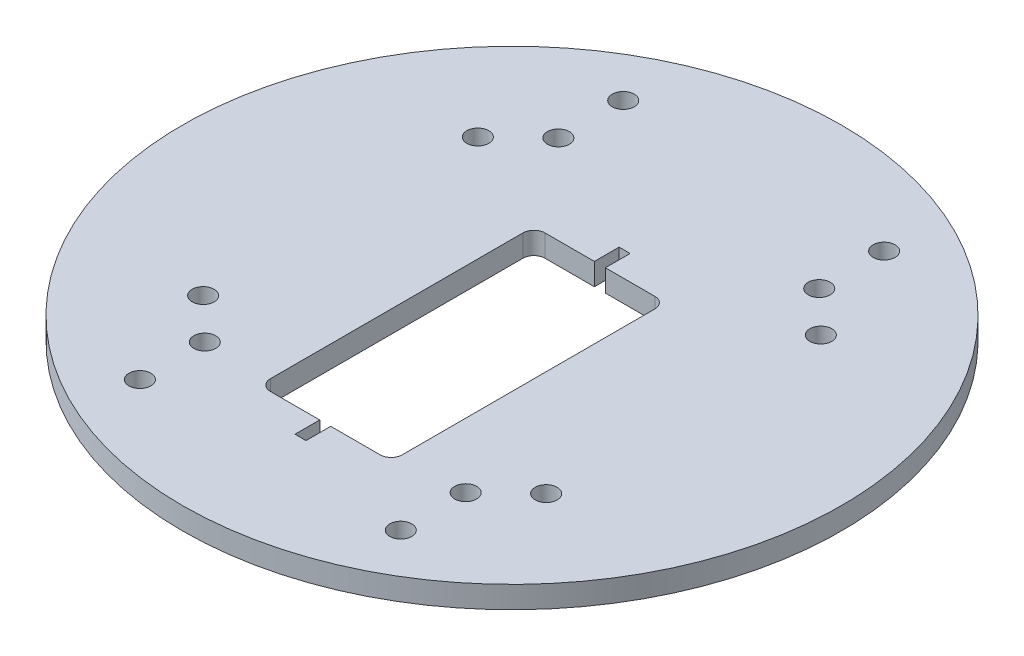
ISO-10303-21;
HEADER;
FILE_DESCRIPTION(('STEP AP214'),'2;1');
FILE_NAME('part.step','',(''),(''),'','','');
FILE_SCHEMA(('AUTOMOTIVE_DESIGN { 1 0 10303 214 1 1 1 1 }'));
ENDSEC;
DATA;
#1=APPLICATION_CONTEXT('core data for automotive mechanical design processes');
#2=APPLICATION_PROTOCOL_DEFINITION('international standard','automotive_design',2000,#1);
#3=PRODUCT_CONTEXT('',#1,'mechanical');
#4=PRODUCT('Part','Part','',(#3));
#5=PRODUCT_RELATED_PRODUCT_CATEGORY('part','',(#4));
#6=PRODUCT_DEFINITION_FORMATION('','',#4);
#7=PRODUCT_DEFINITION_CONTEXT('part definition',#1,'design');
#8=PRODUCT_DEFINITION('design','',#6,#7);
#9=PRODUCT_DEFINITION_SHAPE('','',#8);
#10=(LENGTH_UNIT() NAMED_UNIT(*) SI_UNIT(.MILLI.,.METRE.));
#11=(NAMED_UNIT(*) PLANE_ANGLE_UNIT() SI_UNIT($,.RADIAN.));
#12=(NAMED_UNIT(*) SI_UNIT($,.STERADIAN.) SOLID_ANGLE_UNIT());
#13=UNCERTAINTY_MEASURE_WITH_UNIT(LENGTH_MEASURE(1.E-05),#10,'distance_accuracy_value','');
#14=(GEOMETRIC_REPRESENTATION_CONTEXT(3) GLOBAL_UNCERTAINTY_ASSIGNED_CONTEXT((#13)) GLOBAL_UNIT_ASSIGNED_CONTEXT((#10,
#11,#12)) REPRESENTATION_CONTEXT('',''));
#15=CARTESIAN_POINT('',(0.,0.,0.));
#16=DIRECTION('',(0.,0.,1.));
#17=DIRECTION('',(1.,0.,0.));
#18=AXIS2_PLACEMENT_3D('',#15,#16,#17);
#19=CARTESIAN_POINT('',(0.,2.,0.));
#20=DIRECTION('',(0.,1.,0.));
#21=DIRECTION('',(0.,0.,1.));
#22=AXIS2_PLACEMENT_3D('',#19,#20,#21);
#23=PLANE('',#22);
#24=DIRECTION('',(0.,0.,1.));
#25=VECTOR('',#24,1.);
#26=CARTESIAN_POINT('',(-0.5,2.,0.));
#27=LINE('',#26,#25);
#28=CARTESIAN_POINT('',(-0.499999999999992,2.,17.));
#29=VERTEX_POINT('',#28);
#30=CARTESIAN_POINT('',(-0.499999999999991,2.,19.25));
#31=VERTEX_POINT('',#30);
#32=EDGE_CURVE('E173',#29,#31,#27,.T.);
#33=ORIENTED_EDGE('',*,*,#32,.F.);
#34=DIRECTION('',(1.,0.,0.));
#35=VECTOR('',#34,1.);
#36=CARTESIAN_POINT('',(0.,2.,17.));
#37=LINE('',#36,#35);
#38=CARTESIAN_POINT('',(-4.99999999999999,2.,17.));
#39=VERTEX_POINT('',#38);
#40=EDGE_CURVE('E95',#39,#29,#37,.T.);
#41=ORIENTED_EDGE('',*,*,#40,.F.);
#42=CARTESIAN_POINT('',(-5.,2.,16.));
#43=DIRECTION('',(0.,1.,0.));
#44=DIRECTION('',(0.,0.,1.));
#45=AXIS2_PLACEMENT_3D('',#42,#43,#44);
#46=CIRCLE('',#45,1.);
#47=CARTESIAN_POINT('',(-6.,2.,16.));
#48=VERTEX_POINT('',#47);
#49=EDGE_CURVE('E40',#48,#39,#46,.T.);
#50=ORIENTED_EDGE('',*,*,#49,.F.);
#51=DIRECTION('',(0.,0.,1.));
#52=VECTOR('',#51,1.);
#53=CARTESIAN_POINT('',(-6.,2.,-6.99999999999999));
#54=LINE('',#53,#52);
#55=CARTESIAN_POINT('',(-6.,2.,-6.99999999999999));
#56=VERTEX_POINT('',#55);
#57=EDGE_CURVE('E88',#56,#48,#54,.T.);
#58=ORIENTED_EDGE('',*,*,#57,.F.);
#59=CARTESIAN_POINT('',(-5.,2.,-7.));
#60=DIRECTION('',(0.,1.,0.));
#61=DIRECTION('',(0.,0.,1.));
#62=AXIS2_PLACEMENT_3D('',#59,#60,#61);
#63=CIRCLE('',#62,1.);
#64=CARTESIAN_POINT('',(-5.,2.,-8.));
#65=VERTEX_POINT('',#64);
#66=EDGE_CURVE('E263',#65,#56,#63,.T.);
#67=ORIENTED_EDGE('',*,*,#66,.F.);
#68=DIRECTION('',(-1.,0.,0.));
#69=VECTOR('',#68,1.);
#70=CARTESIAN_POINT('',(0.,2.,-8.));
#71=LINE('',#70,#69);
#72=CARTESIAN_POINT('',(-0.500000000000012,2.,-8.));
#73=VERTEX_POINT('',#72);
#74=EDGE_CURVE('E178',#73,#65,#71,.T.);
#75=ORIENTED_EDGE('',*,*,#74,.F.);
#76=DIRECTION('',(0.,0.,1.));
#77=VECTOR('',#76,1.);
#78=CARTESIAN_POINT('',(-0.500000000000009,2.,0.));
#79=LINE('',#78,#77);
#80=CARTESIAN_POINT('',(-0.500000000000012,2.,-10.25));
#81=VERTEX_POINT('',#80);
#82=EDGE_CURVE('E267',#81,#73,#79,.T.);
#83=ORIENTED_EDGE('',*,*,#82,.F.);
#84=DIRECTION('',(-1.,0.,0.));
#85=VECTOR('',#84,1.);
#86=CARTESIAN_POINT('',(0.,2.,-10.25));
#87=LINE('',#86,#85);
#88=CARTESIAN_POINT('',(0.499999999999988,2.,-10.25));
#89=VERTEX_POINT('',#88);
#90=EDGE_CURVE('E271',#89,#81,#87,.T.);
#91=ORIENTED_EDGE('',*,*,#90,.F.);
#92=DIRECTION('',(0.,0.,-1.));
#93=VECTOR('',#92,1.);
#94=CARTESIAN_POINT('',(0.499999999999991,2.,0.));
#95=LINE('',#94,#93);
#96=CARTESIAN_POINT('',(0.499999999999988,2.,-8.));
#97=VERTEX_POINT('',#96);
#98=EDGE_CURVE('E275',#97,#89,#95,.T.);
#99=ORIENTED_EDGE('',*,*,#98,.F.);
#100=DIRECTION('',(-1.,0.,0.));
#101=VECTOR('',#100,1.);
#102=CARTESIAN_POINT('',(0.,2.,-8.));
#103=LINE('',#102,#101);
#104=CARTESIAN_POINT('',(4.99999999999999,2.,-8.));
#105=VERTEX_POINT('',#104);
#106=EDGE_CURVE('E262',#105,#97,#103,.T.);
#107=ORIENTED_EDGE('',*,*,#106,.F.);
#108=CARTESIAN_POINT('',(5.,2.,-7.));
#109=DIRECTION('',(0.,1.,0.));
#110=DIRECTION('',(0.,0.,1.));
#111=AXIS2_PLACEMENT_3D('',#108,#109,#110);
#112=CIRCLE('',#111,1.);
#113=CARTESIAN_POINT('',(6.,2.,-6.99999999999999));
#114=VERTEX_POINT('',#113);
#115=EDGE_CURVE('E259',#114,#105,#112,.T.);
#116=ORIENTED_EDGE('',*,*,#115,.F.);
#117=DIRECTION('',(0.,0.,-1.));
#118=VECTOR('',#117,1.);
#119=CARTESIAN_POINT('',(6.,2.,-6.99999999999999));
#120=LINE('',#119,#118);
#121=CARTESIAN_POINT('',(6.,2.,16.));
#122=VERTEX_POINT('',#121);
#123=EDGE_CURVE('E256',#122,#114,#120,.T.);
#124=ORIENTED_EDGE('',*,*,#123,.F.);
#125=CARTESIAN_POINT('',(5.,2.,16.));
#126=DIRECTION('',(0.,1.,0.));
#127=DIRECTION('',(0.,0.,1.));
#128=AXIS2_PLACEMENT_3D('',#125,#126,#127);
#129=CIRCLE('',#128,1.);
#130=CARTESIAN_POINT('',(5.,2.,17.));
#131=VERTEX_POINT('',#130);
#132=EDGE_CURVE('E254',#131,#122,#129,.T.);
#133=ORIENTED_EDGE('',*,*,#132,.F.);
#134=DIRECTION('',(1.,0.,0.));
#135=VECTOR('',#134,1.);
#136=CARTESIAN_POINT('',(0.,2.,17.));
#137=LINE('',#136,#135);
#138=CARTESIAN_POINT('',(0.500000000000008,2.,17.));
#139=VERTEX_POINT('',#138);
#140=EDGE_CURVE('E257',#139,#131,#137,.T.);
#141=ORIENTED_EDGE('',*,*,#140,.F.);
#142=DIRECTION('',(0.,0.,-1.));
#143=VECTOR('',#142,1.);
#144=CARTESIAN_POINT('',(0.500000000000008,2.,0.));
#145=LINE('',#144,#143);
#146=CARTESIAN_POINT('',(0.500000000000008,2.,19.25));
#147=VERTEX_POINT('',#146);
#148=EDGE_CURVE('E281',#147,#139,#145,.T.);
#149=ORIENTED_EDGE('',*,*,#148,.F.);
#150=DIRECTION('',(1.,0.,0.));
#151=VECTOR('',#150,1.);
#152=CARTESIAN_POINT('',(0.,2.,19.25));
#153=LINE('',#152,#151);
#154=EDGE_CURVE('E283',#31,#147,#153,.T.);
#155=ORIENTED_EDGE('',*,*,#154,.F.);
#156=EDGE_LOOP('',(#33,#41,#50,#58,#67,#75,#83,#91,#99,#107,#116,#124,#133,#141,#149,#155));
#157=FACE_BOUND('',#156,.T.);
#158=CARTESIAN_POINT('',(15.612494995996,2.,12.5));
#159=DIRECTION('',(0.,1.,0.));
#160=DIRECTION('',(0.,0.,1.));
#161=AXIS2_PLACEMENT_3D('',#158,#159,#160);
#162=CIRCLE('',#161,1.);
#163=CARTESIAN_POINT('',(15.612494995996,2.,13.5));
#164=VERTEX_POINT('',#163);
#165=EDGE_CURVE('E187',#164,#164,#162,.T.);
#166=ORIENTED_EDGE('',*,*,#165,.F.);
#167=EDGE_LOOP('',(#166));
#168=FACE_BOUND('',#167,.T.);
#169=CARTESIAN_POINT('',(-15.612494995996,2.,-12.5));
#170=DIRECTION('',(0.,1.,0.));
#171=DIRECTION('',(0.,0.,1.));
#172=AXIS2_PLACEMENT_3D('',#169,#170,#171);
#173=CIRCLE('',#172,1.);
#174=CARTESIAN_POINT('',(-15.612494995996,2.,-11.5));
#175=VERTEX_POINT('',#174);
#176=EDGE_CURVE('E199',#175,#175,#173,.T.);
#177=ORIENTED_EDGE('',*,*,#176,.F.);
#178=EDGE_LOOP('',(#177));
#179=FACE_BOUND('',#178,.T.);
#180=CARTESIAN_POINT('',(11.8743420870379,2.,-16.0934769394311));
#181=DIRECTION('',(0.,1.,0.));
#182=DIRECTION('',(0.,0.,1.));
#183=AXIS2_PLACEMENT_3D('',#180,#181,#182);
#184=CIRCLE('',#183,1.);
#185=CARTESIAN_POINT('',(11.8743420870379,2.,-15.0934769394311));
#186=VERTEX_POINT('',#185);
#187=EDGE_CURVE('E211',#186,#186,#184,.T.);
#188=ORIENTED_EDGE('',*,*,#187,.F.);
#189=EDGE_LOOP('',(#188));
#190=FACE_BOUND('',#189,.T.);
#191=CARTESIAN_POINT('',(-11.8743420870379,2.,-16.0934769394311));
#192=DIRECTION('',(0.,1.,0.));
#193=DIRECTION('',(0.,0.,1.));
#194=AXIS2_PLACEMENT_3D('',#191,#192,#193);
#195=CIRCLE('',#194,1.);
#196=CARTESIAN_POINT('',(-11.8743420870379,2.,-15.0934769394311));
#197=VERTEX_POINT('',#196);
#198=EDGE_CURVE('E223',#197,#197,#195,.T.);
#199=ORIENTED_EDGE('',*,*,#198,.F.);
#200=EDGE_LOOP('',(#199));
#201=FACE_BOUND('',#200,.T.);
#202=CARTESIAN_POINT('',(11.8743420870379,2.,22.));
#203=DIRECTION('',(0.,1.,0.));
#204=DIRECTION('',(0.,0.,1.));
#205=AXIS2_PLACEMENT_3D('',#202,#203,#204);
#206=CIRCLE('',#205,1.);
#207=CARTESIAN_POINT('',(11.8743420870379,2.,23.));
#208=VERTEX_POINT('',#207);
#209=EDGE_CURVE('E235',#208,#208,#206,.T.);
#210=ORIENTED_EDGE('',*,*,#209,.F.);
#211=EDGE_LOOP('',(#210));
#212=FACE_BOUND('',#211,.T.);
#213=CARTESIAN_POINT('',(-11.8743420870379,2.,-22.));
#214=DIRECTION('',(0.,1.,0.));
#215=DIRECTION('',(0.,0.,1.));
#216=AXIS2_PLACEMENT_3D('',#213,#214,#215);
#217=CIRCLE('',#216,1.);
#218=CARTESIAN_POINT('',(-11.8743420870379,2.,-21.));
#219=VERTEX_POINT('',#218);
#220=EDGE_CURVE('E247',#219,#219,#217,.T.);
#221=ORIENTED_EDGE('',*,*,#220,.F.);
#222=EDGE_LOOP('',(#221));
#223=FACE_BOUND('',#222,.T.);
#224=CARTESIAN_POINT('',(0.,2.,0.));
#225=DIRECTION('',(0.,1.,0.));
#226=DIRECTION('',(0.,0.,1.));
#227=AXIS2_PLACEMENT_3D('',#224,#225,#226);
#228=CIRCLE('',#227,30.);
#229=CARTESIAN_POINT('',(0.,2.,30.));
#230=VERTEX_POINT('',#229);
#231=EDGE_CURVE('E11',#230,#230,#228,.T.);
#232=ORIENTED_EDGE('',*,*,#231,.T.);
#233=EDGE_LOOP('',(#232));
#234=FACE_BOUND('',#233,.T.);
#235=CARTESIAN_POINT('',(11.8743420870379,2.,-22.));
#236=DIRECTION('',(0.,1.,0.));
#237=DIRECTION('',(0.,0.,1.));
#238=AXIS2_PLACEMENT_3D('',#235,#236,#237);
#239=CIRCLE('',#238,1.);
#240=CARTESIAN_POINT('',(11.8743420870379,2.,-21.));
#241=VERTEX_POINT('',#240);
#242=EDGE_CURVE('E241',#241,#241,#239,.T.);
#243=ORIENTED_EDGE('',*,*,#242,.F.);
#244=EDGE_LOOP('',(#243));
#245=FACE_BOUND('',#244,.T.);
#246=CARTESIAN_POINT('',(-11.8743420870379,2.,22.));
#247=DIRECTION('',(0.,1.,0.));
#248=DIRECTION('',(0.,0.,1.));
#249=AXIS2_PLACEMENT_3D('',#246,#247,#248);
#250=CIRCLE('',#249,1.);
#251=CARTESIAN_POINT('',(-11.8743420870379,2.,23.));
#252=VERTEX_POINT('',#251);
#253=EDGE_CURVE('E229',#252,#252,#250,.T.);
#254=ORIENTED_EDGE('',*,*,#253,.F.);
#255=EDGE_LOOP('',(#254));
#256=FACE_BOUND('',#255,.T.);
#257=CARTESIAN_POINT('',(11.8743420870379,2.,16.0934769394311));
#258=DIRECTION('',(0.,1.,0.));
#259=DIRECTION('',(0.,0.,1.));
#260=AXIS2_PLACEMENT_3D('',#257,#258,#259);
#261=CIRCLE('',#260,1.);
#262=CARTESIAN_POINT('',(11.8743420870379,2.,17.0934769394311));
#263=VERTEX_POINT('',#262);
#264=EDGE_CURVE('E217',#263,#263,#261,.T.);
#265=ORIENTED_EDGE('',*,*,#264,.F.);
#266=EDGE_LOOP('',(#265));
#267=FACE_BOUND('',#266,.T.);
#268=CARTESIAN_POINT('',(-11.8743420870379,2.,16.0934769394311));
#269=DIRECTION('',(0.,1.,0.));
#270=DIRECTION('',(0.,0.,1.));
#271=AXIS2_PLACEMENT_3D('',#268,#269,#270);
#272=CIRCLE('',#271,1.);
#273=CARTESIAN_POINT('',(-11.8743420870379,2.,17.0934769394311));
#274=VERTEX_POINT('',#273);
#275=EDGE_CURVE('E205',#274,#274,#272,.T.);
#276=ORIENTED_EDGE('',*,*,#275,.F.);
#277=EDGE_LOOP('',(#276));
#278=FACE_BOUND('',#277,.T.);
#279=CARTESIAN_POINT('',(15.612494995996,2.,-12.5));
#280=DIRECTION('',(0.,1.,0.));
#281=DIRECTION('',(0.,0.,1.));
#282=AXIS2_PLACEMENT_3D('',#279,#280,#281);
#283=CIRCLE('',#282,1.);
#284=CARTESIAN_POINT('',(15.612494995996,2.,-11.5));
#285=VERTEX_POINT('',#284);
#286=EDGE_CURVE('E193',#285,#285,#283,.T.);
#287=ORIENTED_EDGE('',*,*,#286,.F.);
#288=EDGE_LOOP('',(#287));
#289=FACE_BOUND('',#288,.T.);
#290=CARTESIAN_POINT('',(-15.612494995996,2.,12.5));
#291=DIRECTION('',(0.,1.,0.));
#292=DIRECTION('',(0.,0.,1.));
#293=AXIS2_PLACEMENT_3D('',#290,#291,#292);
#294=CIRCLE('',#293,1.);
#295=CARTESIAN_POINT('',(-15.612494995996,2.,13.5));
#296=VERTEX_POINT('',#295);
#297=EDGE_CURVE('E181',#296,#296,#294,.T.);
#298=ORIENTED_EDGE('',*,*,#297,.F.);
#299=EDGE_LOOP('',(#298));
#300=FACE_BOUND('',#299,.T.);
#301=ADVANCED_FACE('F36',(#157,#168,#179,#190,#201,#212,#223,#234,#245,#256,#267,#278,#289,
#300),#23,.T.);
#302=CARTESIAN_POINT('',(0.,0.,0.));
#303=DIRECTION('',(0.,1.,0.));
#304=DIRECTION('',(0.,0.,1.));
#305=AXIS2_PLACEMENT_3D('',#302,#303,#304);
#306=PLANE('',#305);
#307=DIRECTION('',(1.,0.,0.));
#308=VECTOR('',#307,1.);
#309=CARTESIAN_POINT('',(-4.99999999999999,0.,17.));
#310=LINE('',#309,#308);
#311=CARTESIAN_POINT('',(-4.99999999999999,0.,17.));
#312=VERTEX_POINT('',#311);
#313=CARTESIAN_POINT('',(-0.499999999999992,0.,17.));
#314=VERTEX_POINT('',#313);
#315=EDGE_CURVE('E160',#312,#314,#310,.T.);
#316=ORIENTED_EDGE('',*,*,#315,.T.);
#317=DIRECTION('',(0.,0.,1.));
#318=VECTOR('',#317,1.);
#319=CARTESIAN_POINT('',(-0.499999999999992,0.,17.));
#320=LINE('',#319,#318);
#321=CARTESIAN_POINT('',(-0.499999999999991,0.,19.25));
#322=VERTEX_POINT('',#321);
#323=EDGE_CURVE('E361',#314,#322,#320,.T.);
#324=ORIENTED_EDGE('',*,*,#323,.T.);
#325=DIRECTION('',(1.,0.,0.));
#326=VECTOR('',#325,1.);
#327=CARTESIAN_POINT('',(-0.499999999999991,0.,19.25));
#328=LINE('',#327,#326);
#329=CARTESIAN_POINT('',(0.500000000000008,0.,19.25));
#330=VERTEX_POINT('',#329);
#331=EDGE_CURVE('E358',#322,#330,#328,.T.);
#332=ORIENTED_EDGE('',*,*,#331,.T.);
#333=DIRECTION('',(0.,0.,-1.));
#334=VECTOR('',#333,1.);
#335=CARTESIAN_POINT('',(0.500000000000008,0.,17.));
#336=LINE('',#335,#334);
#337=CARTESIAN_POINT('',(0.500000000000008,0.,17.));
#338=VERTEX_POINT('',#337);
#339=EDGE_CURVE('E355',#330,#338,#336,.T.);
#340=ORIENTED_EDGE('',*,*,#339,.T.);
#341=DIRECTION('',(1.,0.,0.));
#342=VECTOR('',#341,1.);
#343=CARTESIAN_POINT('',(0.500000000000008,0.,17.));
#344=LINE('',#343,#342);
#345=CARTESIAN_POINT('',(5.,0.,17.));
#346=VERTEX_POINT('',#345);
#347=EDGE_CURVE('E352',#338,#346,#344,.T.);
#348=ORIENTED_EDGE('',*,*,#347,.T.);
#349=CARTESIAN_POINT('',(5.,0.,16.));
#350=DIRECTION('',(0.,1.,0.));
#351=DIRECTION('',(0.,0.,1.));
#352=AXIS2_PLACEMENT_3D('',#349,#350,#351);
#353=CIRCLE('',#352,1.);
#354=CARTESIAN_POINT('',(6.,0.,16.));
#355=VERTEX_POINT('',#354);
#356=EDGE_CURVE('E349',#346,#355,#353,.T.);
#357=ORIENTED_EDGE('',*,*,#356,.T.);
#358=DIRECTION('',(0.,0.,-1.));
#359=VECTOR('',#358,1.);
#360=CARTESIAN_POINT('',(6.,0.,-6.99999999999999));
#361=LINE('',#360,#359);
#362=CARTESIAN_POINT('',(6.,0.,-6.99999999999999));
#363=VERTEX_POINT('',#362);
#364=EDGE_CURVE('E346',#355,#363,#361,.T.);
#365=ORIENTED_EDGE('',*,*,#364,.T.);
#366=CARTESIAN_POINT('',(5.,0.,-7.));
#367=DIRECTION('',(0.,1.,0.));
#368=DIRECTION('',(0.,0.,-1.));
#369=AXIS2_PLACEMENT_3D('',#366,#367,#368);
#370=CIRCLE('',#369,1.);
#371=CARTESIAN_POINT('',(4.99999999999999,0.,-8.));
#372=VERTEX_POINT('',#371);
#373=EDGE_CURVE('E343',#363,#372,#370,.T.);
#374=ORIENTED_EDGE('',*,*,#373,.T.);
#375=DIRECTION('',(-1.,0.,0.));
#376=VECTOR('',#375,1.);
#377=CARTESIAN_POINT('',(0.499999999999988,0.,-8.));
#378=LINE('',#377,#376);
#379=CARTESIAN_POINT('',(0.499999999999988,0.,-8.));
#380=VERTEX_POINT('',#379);
#381=EDGE_CURVE('E340',#372,#380,#378,.T.);
#382=ORIENTED_EDGE('',*,*,#381,.T.);
#383=DIRECTION('',(0.,0.,-1.));
#384=VECTOR('',#383,1.);
#385=CARTESIAN_POINT('',(0.499999999999988,0.,-10.25));
#386=LINE('',#385,#384);
#387=CARTESIAN_POINT('',(0.499999999999988,0.,-10.25));
#388=VERTEX_POINT('',#387);
#389=EDGE_CURVE('E337',#380,#388,#386,.T.);
#390=ORIENTED_EDGE('',*,*,#389,.T.);
#391=DIRECTION('',(-1.,0.,0.));
#392=VECTOR('',#391,1.);
#393=CARTESIAN_POINT('',(-0.500000000000012,0.,-10.25));
#394=LINE('',#393,#392);
#395=CARTESIAN_POINT('',(-0.500000000000012,0.,-10.25));
#396=VERTEX_POINT('',#395);
#397=EDGE_CURVE('E334',#388,#396,#394,.T.);
#398=ORIENTED_EDGE('',*,*,#397,.T.);
#399=DIRECTION('',(0.,0.,1.));
#400=VECTOR('',#399,1.);
#401=CARTESIAN_POINT('',(-0.500000000000012,0.,-10.25));
#402=LINE('',#401,#400);
#403=CARTESIAN_POINT('',(-0.500000000000012,0.,-8.));
#404=VERTEX_POINT('',#403);
#405=EDGE_CURVE('E331',#396,#404,#402,.T.);
#406=ORIENTED_EDGE('',*,*,#405,.T.);
#407=DIRECTION('',(-1.,0.,0.));
#408=VECTOR('',#407,1.);
#409=CARTESIAN_POINT('',(-5.,0.,-8.));
#410=LINE('',#409,#408);
#411=CARTESIAN_POINT('',(-5.,0.,-8.));
#412=VERTEX_POINT('',#411);
#413=EDGE_CURVE('E328',#404,#412,#410,.T.);
#414=ORIENTED_EDGE('',*,*,#413,.T.);
#415=CARTESIAN_POINT('',(-5.,0.,-7.));
#416=DIRECTION('',(0.,1.,0.));
#417=DIRECTION('',(0.,0.,1.));
#418=AXIS2_PLACEMENT_3D('',#415,#416,#417);
#419=CIRCLE('',#418,1.);
#420=CARTESIAN_POINT('',(-6.,0.,-6.99999999999999));
#421=VERTEX_POINT('',#420);
#422=EDGE_CURVE('E325',#412,#421,#419,.T.);
#423=ORIENTED_EDGE('',*,*,#422,.T.);
#424=DIRECTION('',(0.,0.,1.));
#425=VECTOR('',#424,1.);
#426=CARTESIAN_POINT('',(-6.,0.,-6.99999999999999));
#427=LINE('',#426,#425);
#428=CARTESIAN_POINT('',(-6.,0.,16.));
#429=VERTEX_POINT('',#428);
#430=EDGE_CURVE('E322',#421,#429,#427,.T.);
#431=ORIENTED_EDGE('',*,*,#430,.T.);
#432=CARTESIAN_POINT('',(-5.,0.,16.));
#433=DIRECTION('',(0.,1.,0.));
#434=DIRECTION('',(0.,0.,1.));
#435=AXIS2_PLACEMENT_3D('',#432,#433,#434);
#436=CIRCLE('',#435,1.);
#437=EDGE_CURVE('E320',#429,#312,#436,.T.);
#438=ORIENTED_EDGE('',*,*,#437,.T.);
#439=EDGE_LOOP('',(#316,#324,#332,#340,#348,#357,#365,#374,#382,#390,#398,#406,#414,#423,#431,#438));
#440=FACE_BOUND('',#439,.T.);
#441=CARTESIAN_POINT('',(0.,0.,0.));
#442=DIRECTION('',(0.,1.,0.));
#443=DIRECTION('',(0.,0.,1.));
#444=AXIS2_PLACEMENT_3D('',#441,#442,#443);
#445=CIRCLE('',#444,30.);
#446=CARTESIAN_POINT('',(0.,0.,30.));
#447=VERTEX_POINT('',#446);
#448=EDGE_CURVE('E46',#447,#447,#445,.T.);
#449=ORIENTED_EDGE('',*,*,#448,.F.);
#450=EDGE_LOOP('',(#449));
#451=FACE_BOUND('',#450,.T.);
#452=CARTESIAN_POINT('',(-11.8743420870379,0.,-22.));
#453=DIRECTION('',(0.,1.,0.));
#454=DIRECTION('',(0.,0.,1.));
#455=AXIS2_PLACEMENT_3D('',#452,#453,#454);
#456=CIRCLE('',#455,1.);
#457=CARTESIAN_POINT('',(-11.8743420870379,0.,-21.));
#458=VERTEX_POINT('',#457);
#459=EDGE_CURVE('E244',#458,#458,#456,.T.);
#460=ORIENTED_EDGE('',*,*,#459,.T.);
#461=EDGE_LOOP('',(#460));
#462=FACE_BOUND('',#461,.T.);
#463=CARTESIAN_POINT('',(11.8743420870379,0.,-22.));
#464=DIRECTION('',(0.,1.,0.));
#465=DIRECTION('',(0.,0.,1.));
#466=AXIS2_PLACEMENT_3D('',#463,#464,#465);
#467=CIRCLE('',#466,1.);
#468=CARTESIAN_POINT('',(11.8743420870379,0.,-21.));
#469=VERTEX_POINT('',#468);
#470=EDGE_CURVE('E238',#469,#469,#467,.T.);
#471=ORIENTED_EDGE('',*,*,#470,.T.);
#472=EDGE_LOOP('',(#471));
#473=FACE_BOUND('',#472,.T.);
#474=CARTESIAN_POINT('',(11.8743420870379,0.,22.));
#475=DIRECTION('',(0.,1.,0.));
#476=DIRECTION('',(0.,0.,1.));
#477=AXIS2_PLACEMENT_3D('',#474,#475,#476);
#478=CIRCLE('',#477,1.);
#479=CARTESIAN_POINT('',(11.8743420870379,0.,23.));
#480=VERTEX_POINT('',#479);
#481=EDGE_CURVE('E232',#480,#480,#478,.T.);
#482=ORIENTED_EDGE('',*,*,#481,.T.);
#483=EDGE_LOOP('',(#482));
#484=FACE_BOUND('',#483,.T.);
#485=CARTESIAN_POINT('',(-11.8743420870379,0.,22.));
#486=DIRECTION('',(0.,1.,0.));
#487=DIRECTION('',(0.,0.,1.));
#488=AXIS2_PLACEMENT_3D('',#485,#486,#487);
#489=CIRCLE('',#488,1.);
#490=CARTESIAN_POINT('',(-11.8743420870379,0.,23.));
#491=VERTEX_POINT('',#490);
#492=EDGE_CURVE('E226',#491,#491,#489,.T.);
#493=ORIENTED_EDGE('',*,*,#492,.T.);
#494=EDGE_LOOP('',(#493));
#495=FACE_BOUND('',#494,.T.);
#496=CARTESIAN_POINT('',(-11.8743420870379,0.,-16.0934769394311));
#497=DIRECTION('',(0.,1.,0.));
#498=DIRECTION('',(0.,0.,1.));
#499=AXIS2_PLACEMENT_3D('',#496,#497,#498);
#500=CIRCLE('',#499,1.);
#501=CARTESIAN_POINT('',(-11.8743420870379,0.,-15.0934769394311));
#502=VERTEX_POINT('',#501);
#503=EDGE_CURVE('E220',#502,#502,#500,.T.);
#504=ORIENTED_EDGE('',*,*,#503,.T.);
#505=EDGE_LOOP('',(#504));
#506=FACE_BOUND('',#505,.T.);
#507=CARTESIAN_POINT('',(11.8743420870379,0.,16.0934769394311));
#508=DIRECTION('',(0.,1.,0.));
#509=DIRECTION('',(0.,0.,1.));
#510=AXIS2_PLACEMENT_3D('',#507,#508,#509);
#511=CIRCLE('',#510,1.);
#512=CARTESIAN_POINT('',(11.8743420870379,0.,17.0934769394311));
#513=VERTEX_POINT('',#512);
#514=EDGE_CURVE('E214',#513,#513,#511,.T.);
#515=ORIENTED_EDGE('',*,*,#514,.T.);
#516=EDGE_LOOP('',(#515));
#517=FACE_BOUND('',#516,.T.);
#518=CARTESIAN_POINT('',(11.8743420870379,0.,-16.0934769394311));
#519=DIRECTION('',(0.,1.,0.));
#520=DIRECTION('',(0.,0.,1.));
#521=AXIS2_PLACEMENT_3D('',#518,#519,#520);
#522=CIRCLE('',#521,1.);
#523=CARTESIAN_POINT('',(11.8743420870379,0.,-15.0934769394311));
#524=VERTEX_POINT('',#523);
#525=EDGE_CURVE('E208',#524,#524,#522,.T.);
#526=ORIENTED_EDGE('',*,*,#525,.T.);
#527=EDGE_LOOP('',(#526));
#528=FACE_BOUND('',#527,.T.);
#529=CARTESIAN_POINT('',(-11.8743420870379,0.,16.0934769394311));
#530=DIRECTION('',(0.,1.,0.));
#531=DIRECTION('',(0.,0.,1.));
#532=AXIS2_PLACEMENT_3D('',#529,#530,#531);
#533=CIRCLE('',#532,1.);
#534=CARTESIAN_POINT('',(-11.8743420870379,0.,17.0934769394311));
#535=VERTEX_POINT('',#534);
#536=EDGE_CURVE('E202',#535,#535,#533,.T.);
#537=ORIENTED_EDGE('',*,*,#536,.T.);
#538=EDGE_LOOP('',(#537));
#539=FACE_BOUND('',#538,.T.);
#540=CARTESIAN_POINT('',(-15.612494995996,0.,-12.5));
#541=DIRECTION('',(0.,1.,0.));
#542=DIRECTION('',(0.,0.,1.));
#543=AXIS2_PLACEMENT_3D('',#540,#541,#542);
#544=CIRCLE('',#543,1.);
#545=CARTESIAN_POINT('',(-15.612494995996,0.,-11.5));
#546=VERTEX_POINT('',#545);
#547=EDGE_CURVE('E196',#546,#546,#544,.T.);
#548=ORIENTED_EDGE('',*,*,#547,.T.);
#549=EDGE_LOOP('',(#548));
#550=FACE_BOUND('',#549,.T.);
#551=CARTESIAN_POINT('',(15.612494995996,0.,-12.5));
#552=DIRECTION('',(0.,1.,0.));
#553=DIRECTION('',(0.,0.,1.));
#554=AXIS2_PLACEMENT_3D('',#551,#552,#553);
#555=CIRCLE('',#554,1.);
#556=CARTESIAN_POINT('',(15.612494995996,0.,-11.5));
#557=VERTEX_POINT('',#556);
#558=EDGE_CURVE('E190',#557,#557,#555,.T.);
#559=ORIENTED_EDGE('',*,*,#558,.T.);
#560=EDGE_LOOP('',(#559));
#561=FACE_BOUND('',#560,.T.);
#562=CARTESIAN_POINT('',(15.612494995996,0.,12.5));
#563=DIRECTION('',(0.,1.,0.));
#564=DIRECTION('',(0.,0.,1.));
#565=AXIS2_PLACEMENT_3D('',#562,#563,#564);
#566=CIRCLE('',#565,1.);
#567=CARTESIAN_POINT('',(15.612494995996,0.,13.5));
#568=VERTEX_POINT('',#567);
#569=EDGE_CURVE('E184',#568,#568,#566,.T.);
#570=ORIENTED_EDGE('',*,*,#569,.T.);
#571=EDGE_LOOP('',(#570));
#572=FACE_BOUND('',#571,.T.);
#573=CARTESIAN_POINT('',(-15.612494995996,0.,12.5));
#574=DIRECTION('',(0.,1.,0.));
#575=DIRECTION('',(0.,0.,1.));
#576=AXIS2_PLACEMENT_3D('',#573,#574,#575);
#577=CIRCLE('',#576,1.);
#578=CARTESIAN_POINT('',(-15.612494995996,0.,13.5));
#579=VERTEX_POINT('',#578);
#580=EDGE_CURVE('E175',#579,#579,#577,.T.);
#581=ORIENTED_EDGE('',*,*,#580,.T.);
#582=EDGE_LOOP('',(#581));
#583=FACE_BOUND('',#582,.T.);
#584=ADVANCED_FACE('F364',(#440,#451,#462,#473,#484,#495,#506,#517,#528,#539,#550,#561,#572,
#583),#306,.F.);
#585=CARTESIAN_POINT('',(0.,2.,0.));
#586=DIRECTION('',(0.,-1.,0.));
#587=DIRECTION('',(0.,0.,-1.));
#588=AXIS2_PLACEMENT_3D('',#585,#586,#587);
#589=CYLINDRICAL_SURFACE('',#588,30.);
#590=ORIENTED_EDGE('',*,*,#231,.F.);
#591=EDGE_LOOP('',(#590));
#592=FACE_BOUND('',#591,.T.);
#593=ORIENTED_EDGE('',*,*,#448,.T.);
#594=EDGE_LOOP('',(#593));
#595=FACE_BOUND('',#594,.T.);
#596=ADVANCED_FACE('F38',(#592,#595),#589,.T.);
#597=CARTESIAN_POINT('',(-11.8743420870379,2.,-22.));
#598=DIRECTION('',(0.,-1.,0.));
#599=DIRECTION('',(0.,0.,-1.));
#600=AXIS2_PLACEMENT_3D('',#597,#598,#599);
#601=CYLINDRICAL_SURFACE('',#600,1.);
#602=ORIENTED_EDGE('',*,*,#220,.T.);
#603=EDGE_LOOP('',(#602));
#604=FACE_BOUND('',#603,.T.);
#605=ORIENTED_EDGE('',*,*,#459,.F.);
#606=EDGE_LOOP('',(#605));
#607=FACE_BOUND('',#606,.T.);
#608=ADVANCED_FACE('F422',(#604,#607),#601,.F.);
#609=CARTESIAN_POINT('',(11.8743420870379,2.,-22.));
#610=DIRECTION('',(0.,-1.,0.));
#611=DIRECTION('',(0.,0.,-1.));
#612=AXIS2_PLACEMENT_3D('',#609,#610,#611);
#613=CYLINDRICAL_SURFACE('',#612,1.);
#614=ORIENTED_EDGE('',*,*,#242,.T.);
#615=EDGE_LOOP('',(#614));
#616=FACE_BOUND('',#615,.T.);
#617=ORIENTED_EDGE('',*,*,#470,.F.);
#618=EDGE_LOOP('',(#617));
#619=FACE_BOUND('',#618,.T.);
#620=ADVANCED_FACE('F425',(#616,#619),#613,.F.);
#621=CARTESIAN_POINT('',(11.8743420870379,2.,22.));
#622=DIRECTION('',(0.,-1.,0.));
#623=DIRECTION('',(0.,0.,-1.));
#624=AXIS2_PLACEMENT_3D('',#621,#622,#623);
#625=CYLINDRICAL_SURFACE('',#624,1.);
#626=ORIENTED_EDGE('',*,*,#209,.T.);
#627=EDGE_LOOP('',(#626));
#628=FACE_BOUND('',#627,.T.);
#629=ORIENTED_EDGE('',*,*,#481,.F.);
#630=EDGE_LOOP('',(#629));
#631=FACE_BOUND('',#630,.T.);
#632=ADVANCED_FACE('F429',(#628,#631),#625,.F.);
#633=CARTESIAN_POINT('',(-11.8743420870379,2.,22.));
#634=DIRECTION('',(0.,-1.,0.));
#635=DIRECTION('',(0.,0.,-1.));
#636=AXIS2_PLACEMENT_3D('',#633,#634,#635);
#637=CYLINDRICAL_SURFACE('',#636,1.);
#638=ORIENTED_EDGE('',*,*,#253,.T.);
#639=EDGE_LOOP('',(#638));
#640=FACE_BOUND('',#639,.T.);
#641=ORIENTED_EDGE('',*,*,#492,.F.);
#642=EDGE_LOOP('',(#641));
#643=FACE_BOUND('',#642,.T.);
#644=ADVANCED_FACE('F433',(#640,#643),#637,.F.);
#645=CARTESIAN_POINT('',(-11.8743420870379,2.,-16.0934769394311));
#646=DIRECTION('',(0.,-1.,0.));
#647=DIRECTION('',(0.,0.,-1.));
#648=AXIS2_PLACEMENT_3D('',#645,#646,#647);
#649=CYLINDRICAL_SURFACE('',#648,1.);
#650=ORIENTED_EDGE('',*,*,#198,.T.);
#651=EDGE_LOOP('',(#650));
#652=FACE_BOUND('',#651,.T.);
#653=ORIENTED_EDGE('',*,*,#503,.F.);
#654=EDGE_LOOP('',(#653));
#655=FACE_BOUND('',#654,.T.);
#656=ADVANCED_FACE('F437',(#652,#655),#649,.F.);
#657=CARTESIAN_POINT('',(11.8743420870379,2.,16.0934769394311));
#658=DIRECTION('',(0.,-1.,0.));
#659=DIRECTION('',(0.,0.,-1.));
#660=AXIS2_PLACEMENT_3D('',#657,#658,#659);
#661=CYLINDRICAL_SURFACE('',#660,1.);
#662=ORIENTED_EDGE('',*,*,#264,.T.);
#663=EDGE_LOOP('',(#662));
#664=FACE_BOUND('',#663,.T.);
#665=ORIENTED_EDGE('',*,*,#514,.F.);
#666=EDGE_LOOP('',(#665));
#667=FACE_BOUND('',#666,.T.);
#668=ADVANCED_FACE('F441',(#664,#667),#661,.F.);
#669=CARTESIAN_POINT('',(11.8743420870379,2.,-16.0934769394311));
#670=DIRECTION('',(0.,-1.,0.));
#671=DIRECTION('',(0.,0.,-1.));
#672=AXIS2_PLACEMENT_3D('',#669,#670,#671);
#673=CYLINDRICAL_SURFACE('',#672,1.);
#674=ORIENTED_EDGE('',*,*,#187,.T.);
#675=EDGE_LOOP('',(#674));
#676=FACE_BOUND('',#675,.T.);
#677=ORIENTED_EDGE('',*,*,#525,.F.);
#678=EDGE_LOOP('',(#677));
#679=FACE_BOUND('',#678,.T.);
#680=ADVANCED_FACE('F445',(#676,#679),#673,.F.);
#681=CARTESIAN_POINT('',(-11.8743420870379,2.,16.0934769394311));
#682=DIRECTION('',(0.,-1.,0.));
#683=DIRECTION('',(0.,0.,-1.));
#684=AXIS2_PLACEMENT_3D('',#681,#682,#683);
#685=CYLINDRICAL_SURFACE('',#684,1.);
#686=ORIENTED_EDGE('',*,*,#275,.T.);
#687=EDGE_LOOP('',(#686));
#688=FACE_BOUND('',#687,.T.);
#689=ORIENTED_EDGE('',*,*,#536,.F.);
#690=EDGE_LOOP('',(#689));
#691=FACE_BOUND('',#690,.T.);
#692=ADVANCED_FACE('F449',(#688,#691),#685,.F.);
#693=CARTESIAN_POINT('',(-15.612494995996,2.,-12.5));
#694=DIRECTION('',(0.,-1.,0.));
#695=DIRECTION('',(0.,0.,-1.));
#696=AXIS2_PLACEMENT_3D('',#693,#694,#695);
#697=CYLINDRICAL_SURFACE('',#696,1.);
#698=ORIENTED_EDGE('',*,*,#176,.T.);
#699=EDGE_LOOP('',(#698));
#700=FACE_BOUND('',#699,.T.);
#701=ORIENTED_EDGE('',*,*,#547,.F.);
#702=EDGE_LOOP('',(#701));
#703=FACE_BOUND('',#702,.T.);
#704=ADVANCED_FACE('F453',(#700,#703),#697,.F.);
#705=CARTESIAN_POINT('',(15.612494995996,2.,-12.5));
#706=DIRECTION('',(0.,-1.,0.));
#707=DIRECTION('',(0.,0.,-1.));
#708=AXIS2_PLACEMENT_3D('',#705,#706,#707);
#709=CYLINDRICAL_SURFACE('',#708,1.);
#710=ORIENTED_EDGE('',*,*,#286,.T.);
#711=EDGE_LOOP('',(#710));
#712=FACE_BOUND('',#711,.T.);
#713=ORIENTED_EDGE('',*,*,#558,.F.);
#714=EDGE_LOOP('',(#713));
#715=FACE_BOUND('',#714,.T.);
#716=ADVANCED_FACE('F457',(#712,#715),#709,.F.);
#717=CARTESIAN_POINT('',(15.612494995996,2.,12.5));
#718=DIRECTION('',(0.,-1.,0.));
#719=DIRECTION('',(0.,0.,-1.));
#720=AXIS2_PLACEMENT_3D('',#717,#718,#719);
#721=CYLINDRICAL_SURFACE('',#720,1.);
#722=ORIENTED_EDGE('',*,*,#165,.T.);
#723=EDGE_LOOP('',(#722));
#724=FACE_BOUND('',#723,.T.);
#725=ORIENTED_EDGE('',*,*,#569,.F.);
#726=EDGE_LOOP('',(#725));
#727=FACE_BOUND('',#726,.T.);
#728=ADVANCED_FACE('F461',(#724,#727),#721,.F.);
#729=CARTESIAN_POINT('',(-15.612494995996,2.,12.5));
#730=DIRECTION('',(0.,-1.,0.));
#731=DIRECTION('',(0.,0.,-1.));
#732=AXIS2_PLACEMENT_3D('',#729,#730,#731);
#733=CYLINDRICAL_SURFACE('',#732,1.);
#734=ORIENTED_EDGE('',*,*,#297,.T.);
#735=EDGE_LOOP('',(#734));
#736=FACE_BOUND('',#735,.T.);
#737=ORIENTED_EDGE('',*,*,#580,.F.);
#738=EDGE_LOOP('',(#737));
#739=FACE_BOUND('',#738,.T.);
#740=ADVANCED_FACE('F465',(#736,#739),#733,.F.);
#741=CARTESIAN_POINT('',(-0.499999999999992,0.,17.));
#742=DIRECTION('',(-1.,0.,0.));
#743=DIRECTION('',(0.,0.,1.));
#744=AXIS2_PLACEMENT_3D('',#741,#742,#743);
#745=PLANE('',#744);
#746=ORIENTED_EDGE('',*,*,#32,.T.);
#747=DIRECTION('',(0.,1.,0.));
#748=VECTOR('',#747,1.);
#749=CARTESIAN_POINT('',(-0.499999999999991,0.,19.25));
#750=LINE('',#749,#748);
#751=EDGE_CURVE('E55',#322,#31,#750,.T.);
#752=ORIENTED_EDGE('',*,*,#751,.F.);
#753=ORIENTED_EDGE('',*,*,#323,.F.);
#754=DIRECTION('',(0.,1.,0.));
#755=VECTOR('',#754,1.);
#756=CARTESIAN_POINT('',(-0.499999999999992,0.,17.));
#757=LINE('',#756,#755);
#758=EDGE_CURVE('E164',#314,#29,#757,.T.);
#759=ORIENTED_EDGE('',*,*,#758,.T.);
#760=EDGE_LOOP('',(#746,#752,#753,#759));
#761=FACE_BOUND('',#760,.T.);
#762=ADVANCED_FACE('F366',(#761),#745,.F.);
#763=CARTESIAN_POINT('',(-4.99999999999999,0.,17.));
#764=DIRECTION('',(0.,0.,1.));
#765=DIRECTION('',(1.,0.,0.));
#766=AXIS2_PLACEMENT_3D('',#763,#764,#765);
#767=PLANE('',#766);
#768=ORIENTED_EDGE('',*,*,#40,.T.);
#769=ORIENTED_EDGE('',*,*,#758,.F.);
#770=ORIENTED_EDGE('',*,*,#315,.F.);
#771=DIRECTION('',(0.,1.,0.));
#772=VECTOR('',#771,1.);
#773=CARTESIAN_POINT('',(-4.99999999999999,0.,17.));
#774=LINE('',#773,#772);
#775=EDGE_CURVE('E156',#312,#39,#774,.T.);
#776=ORIENTED_EDGE('',*,*,#775,.T.);
#777=EDGE_LOOP('',(#768,#769,#770,#776));
#778=FACE_BOUND('',#777,.T.);
#779=ADVANCED_FACE('F158',(#778),#767,.F.);
#780=CARTESIAN_POINT('',(-5.,0.,16.));
#781=DIRECTION('',(0.,1.,0.));
#782=DIRECTION('',(0.,0.,1.));
#783=AXIS2_PLACEMENT_3D('',#780,#781,#782);
#784=CYLINDRICAL_SURFACE('',#783,1.);
#785=ORIENTED_EDGE('',*,*,#49,.T.);
#786=ORIENTED_EDGE('',*,*,#775,.F.);
#787=ORIENTED_EDGE('',*,*,#437,.F.);
#788=DIRECTION('',(0.,1.,0.));
#789=VECTOR('',#788,1.);
#790=CARTESIAN_POINT('',(-6.,0.,16.));
#791=LINE('',#790,#789);
#792=EDGE_CURVE('E165',#429,#48,#791,.T.);
#793=ORIENTED_EDGE('',*,*,#792,.T.);
#794=EDGE_LOOP('',(#785,#786,#787,#793));
#795=FACE_BOUND('',#794,.T.);
#796=ADVANCED_FACE('F168',(#795),#784,.F.);
#797=CARTESIAN_POINT('',(-6.,0.,-6.99999999999999));
#798=DIRECTION('',(-1.,0.,0.));
#799=DIRECTION('',(0.,0.,1.));
#800=AXIS2_PLACEMENT_3D('',#797,#798,#799);
#801=PLANE('',#800);
#802=ORIENTED_EDGE('',*,*,#57,.T.);
#803=ORIENTED_EDGE('',*,*,#792,.F.);
#804=ORIENTED_EDGE('',*,*,#430,.F.);
#805=DIRECTION('',(0.,1.,0.));
#806=VECTOR('',#805,1.);
#807=CARTESIAN_POINT('',(-6.,0.,-6.99999999999999));
#808=LINE('',#807,#806);
#809=EDGE_CURVE('E300',#421,#56,#808,.T.);
#810=ORIENTED_EDGE('',*,*,#809,.T.);
#811=EDGE_LOOP('',(#802,#803,#804,#810));
#812=FACE_BOUND('',#811,.T.);
#813=ADVANCED_FACE('F407',(#812),#801,.F.);
#814=CARTESIAN_POINT('',(-5.,0.,-7.));
#815=DIRECTION('',(0.,1.,0.));
#816=DIRECTION('',(0.,0.,1.));
#817=AXIS2_PLACEMENT_3D('',#814,#815,#816);
#818=CYLINDRICAL_SURFACE('',#817,1.);
#819=ORIENTED_EDGE('',*,*,#66,.T.);
#820=ORIENTED_EDGE('',*,*,#809,.F.);
#821=ORIENTED_EDGE('',*,*,#422,.F.);
#822=DIRECTION('',(0.,1.,0.));
#823=VECTOR('',#822,1.);
#824=CARTESIAN_POINT('',(-5.,0.,-8.));
#825=LINE('',#824,#823);
#826=EDGE_CURVE('E298',#412,#65,#825,.T.);
#827=ORIENTED_EDGE('',*,*,#826,.T.);
#828=EDGE_LOOP('',(#819,#820,#821,#827));
#829=FACE_BOUND('',#828,.T.);
#830=ADVANCED_FACE('F406',(#829),#818,.F.);
#831=CARTESIAN_POINT('',(-5.,0.,-8.));
#832=DIRECTION('',(0.,0.,-1.));
#833=DIRECTION('',(-1.,0.,0.));
#834=AXIS2_PLACEMENT_3D('',#831,#832,#833);
#835=PLANE('',#834);
#836=ORIENTED_EDGE('',*,*,#74,.T.);
#837=ORIENTED_EDGE('',*,*,#826,.F.);
#838=ORIENTED_EDGE('',*,*,#413,.F.);
#839=DIRECTION('',(0.,1.,0.));
#840=VECTOR('',#839,1.);
#841=CARTESIAN_POINT('',(-0.500000000000012,0.,-8.));
#842=LINE('',#841,#840);
#843=EDGE_CURVE('E301',#404,#73,#842,.T.);
#844=ORIENTED_EDGE('',*,*,#843,.T.);
#845=EDGE_LOOP('',(#836,#837,#838,#844));
#846=FACE_BOUND('',#845,.T.);
#847=ADVANCED_FACE('F403',(#846),#835,.F.);
#848=CARTESIAN_POINT('',(-0.500000000000012,0.,-10.25));
#849=DIRECTION('',(-1.,0.,0.));
#850=DIRECTION('',(0.,0.,1.));
#851=AXIS2_PLACEMENT_3D('',#848,#849,#850);
#852=PLANE('',#851);
#853=ORIENTED_EDGE('',*,*,#82,.T.);
#854=ORIENTED_EDGE('',*,*,#843,.F.);
#855=ORIENTED_EDGE('',*,*,#405,.F.);
#856=DIRECTION('',(0.,1.,0.));
#857=VECTOR('',#856,1.);
#858=CARTESIAN_POINT('',(-0.500000000000012,0.,-10.25));
#859=LINE('',#858,#857);
#860=EDGE_CURVE('E315',#396,#81,#859,.T.);
#861=ORIENTED_EDGE('',*,*,#860,.T.);
#862=EDGE_LOOP('',(#853,#854,#855,#861));
#863=FACE_BOUND('',#862,.T.);
#864=ADVANCED_FACE('F401',(#863),#852,.F.);
#865=CARTESIAN_POINT('',(-0.500000000000012,0.,-10.25));
#866=DIRECTION('',(0.,0.,-1.));
#867=DIRECTION('',(-1.,0.,0.));
#868=AXIS2_PLACEMENT_3D('',#865,#866,#867);
#869=PLANE('',#868);
#870=ORIENTED_EDGE('',*,*,#90,.T.);
#871=ORIENTED_EDGE('',*,*,#860,.F.);
#872=ORIENTED_EDGE('',*,*,#397,.F.);
#873=DIRECTION('',(0.,1.,0.));
#874=VECTOR('',#873,1.);
#875=CARTESIAN_POINT('',(0.499999999999988,0.,-10.25));
#876=LINE('',#875,#874);
#877=EDGE_CURVE('E312',#388,#89,#876,.T.);
#878=ORIENTED_EDGE('',*,*,#877,.T.);
#879=EDGE_LOOP('',(#870,#871,#872,#878));
#880=FACE_BOUND('',#879,.T.);
#881=ADVANCED_FACE('F399',(#880),#869,.F.);
#882=CARTESIAN_POINT('',(0.499999999999988,0.,-10.25));
#883=DIRECTION('',(1.,0.,0.));
#884=DIRECTION('',(0.,0.,-1.));
#885=AXIS2_PLACEMENT_3D('',#882,#883,#884);
#886=PLANE('',#885);
#887=ORIENTED_EDGE('',*,*,#98,.T.);
#888=ORIENTED_EDGE('',*,*,#877,.F.);
#889=ORIENTED_EDGE('',*,*,#389,.F.);
#890=DIRECTION('',(0.,1.,0.));
#891=VECTOR('',#890,1.);
#892=CARTESIAN_POINT('',(0.499999999999988,0.,-8.));
#893=LINE('',#892,#891);
#894=EDGE_CURVE('E295',#380,#97,#893,.T.);
#895=ORIENTED_EDGE('',*,*,#894,.T.);
#896=EDGE_LOOP('',(#887,#888,#889,#895));
#897=FACE_BOUND('',#896,.T.);
#898=ADVANCED_FACE('F395',(#897),#886,.F.);
#899=CARTESIAN_POINT('',(0.499999999999988,0.,-8.));
#900=DIRECTION('',(0.,0.,-1.));
#901=DIRECTION('',(-1.,0.,0.));
#902=AXIS2_PLACEMENT_3D('',#899,#900,#901);
#903=PLANE('',#902);
#904=ORIENTED_EDGE('',*,*,#106,.T.);
#905=ORIENTED_EDGE('',*,*,#894,.F.);
#906=ORIENTED_EDGE('',*,*,#381,.F.);
#907=DIRECTION('',(0.,1.,0.));
#908=VECTOR('',#907,1.);
#909=CARTESIAN_POINT('',(4.99999999999999,0.,-8.));
#910=LINE('',#909,#908);
#911=EDGE_CURVE('E293',#372,#105,#910,.T.);
#912=ORIENTED_EDGE('',*,*,#911,.T.);
#913=EDGE_LOOP('',(#904,#905,#906,#912));
#914=FACE_BOUND('',#913,.T.);
#915=ADVANCED_FACE('F391',(#914),#903,.F.);
#916=CARTESIAN_POINT('',(5.,0.,-7.));
#917=DIRECTION('',(0.,1.,0.));
#918=DIRECTION('',(0.,0.,1.));
#919=AXIS2_PLACEMENT_3D('',#916,#917,#918);
#920=CYLINDRICAL_SURFACE('',#919,1.);
#921=ORIENTED_EDGE('',*,*,#115,.T.);
#922=ORIENTED_EDGE('',*,*,#911,.F.);
#923=ORIENTED_EDGE('',*,*,#373,.F.);
#924=DIRECTION('',(0.,1.,0.));
#925=VECTOR('',#924,1.);
#926=CARTESIAN_POINT('',(6.,0.,-6.99999999999999));
#927=LINE('',#926,#925);
#928=EDGE_CURVE('E292',#363,#114,#927,.T.);
#929=ORIENTED_EDGE('',*,*,#928,.T.);
#930=EDGE_LOOP('',(#921,#922,#923,#929));
#931=FACE_BOUND('',#930,.T.);
#932=ADVANCED_FACE('F387',(#931),#920,.F.);
#933=CARTESIAN_POINT('',(6.,0.,-6.99999999999999));
#934=DIRECTION('',(1.,0.,0.));
#935=DIRECTION('',(0.,0.,-1.));
#936=AXIS2_PLACEMENT_3D('',#933,#934,#935);
#937=PLANE('',#936);
#938=ORIENTED_EDGE('',*,*,#123,.T.);
#939=ORIENTED_EDGE('',*,*,#928,.F.);
#940=ORIENTED_EDGE('',*,*,#364,.F.);
#941=DIRECTION('',(0.,1.,0.));
#942=VECTOR('',#941,1.);
#943=CARTESIAN_POINT('',(6.,0.,16.));
#944=LINE('',#943,#942);
#945=EDGE_CURVE('E288',#355,#122,#944,.T.);
#946=ORIENTED_EDGE('',*,*,#945,.T.);
#947=EDGE_LOOP('',(#938,#939,#940,#946));
#948=FACE_BOUND('',#947,.T.);
#949=ADVANCED_FACE('F383',(#948),#937,.F.);
#950=CARTESIAN_POINT('',(5.,0.,16.));
#951=DIRECTION('',(0.,1.,0.));
#952=DIRECTION('',(0.,0.,1.));
#953=AXIS2_PLACEMENT_3D('',#950,#951,#952);
#954=CYLINDRICAL_SURFACE('',#953,1.);
#955=ORIENTED_EDGE('',*,*,#132,.T.);
#956=ORIENTED_EDGE('',*,*,#945,.F.);
#957=ORIENTED_EDGE('',*,*,#356,.F.);
#958=DIRECTION('',(0.,1.,0.));
#959=VECTOR('',#958,1.);
#960=CARTESIAN_POINT('',(5.,0.,17.));
#961=LINE('',#960,#959);
#962=EDGE_CURVE('E285',#346,#131,#961,.T.);
#963=ORIENTED_EDGE('',*,*,#962,.T.);
#964=EDGE_LOOP('',(#955,#956,#957,#963));
#965=FACE_BOUND('',#964,.T.);
#966=ADVANCED_FACE('F379',(#965),#954,.F.);
#967=CARTESIAN_POINT('',(0.500000000000008,0.,17.));
#968=DIRECTION('',(0.,0.,1.));
#969=DIRECTION('',(1.,0.,0.));
#970=AXIS2_PLACEMENT_3D('',#967,#968,#969);
#971=PLANE('',#970);
#972=ORIENTED_EDGE('',*,*,#140,.T.);
#973=ORIENTED_EDGE('',*,*,#962,.F.);
#974=ORIENTED_EDGE('',*,*,#347,.F.);
#975=DIRECTION('',(0.,1.,0.));
#976=VECTOR('',#975,1.);
#977=CARTESIAN_POINT('',(0.500000000000008,0.,17.));
#978=LINE('',#977,#976);
#979=EDGE_CURVE('E289',#338,#139,#978,.T.);
#980=ORIENTED_EDGE('',*,*,#979,.T.);
#981=EDGE_LOOP('',(#972,#973,#974,#980));
#982=FACE_BOUND('',#981,.T.);
#983=ADVANCED_FACE('F376',(#982),#971,.F.);
#984=CARTESIAN_POINT('',(0.500000000000008,0.,17.));
#985=DIRECTION('',(1.,0.,0.));
#986=DIRECTION('',(0.,0.,-1.));
#987=AXIS2_PLACEMENT_3D('',#984,#985,#986);
#988=PLANE('',#987);
#989=ORIENTED_EDGE('',*,*,#148,.T.);
#990=ORIENTED_EDGE('',*,*,#979,.F.);
#991=ORIENTED_EDGE('',*,*,#339,.F.);
#992=DIRECTION('',(0.,1.,0.));
#993=VECTOR('',#992,1.);
#994=CARTESIAN_POINT('',(0.500000000000008,0.,19.25));
#995=LINE('',#994,#993);
#996=EDGE_CURVE('E305',#330,#147,#995,.T.);
#997=ORIENTED_EDGE('',*,*,#996,.T.);
#998=EDGE_LOOP('',(#989,#990,#991,#997));
#999=FACE_BOUND('',#998,.T.);
#1000=ADVANCED_FACE('F372',(#999),#988,.F.);
#1001=CARTESIAN_POINT('',(-0.499999999999991,0.,19.25));
#1002=DIRECTION('',(0.,0.,1.));
#1003=DIRECTION('',(1.,0.,0.));
#1004=AXIS2_PLACEMENT_3D('',#1001,#1002,#1003);
#1005=PLANE('',#1004);
#1006=ORIENTED_EDGE('',*,*,#154,.T.);
#1007=ORIENTED_EDGE('',*,*,#996,.F.);
#1008=ORIENTED_EDGE('',*,*,#331,.F.);
#1009=ORIENTED_EDGE('',*,*,#751,.T.);
#1010=EDGE_LOOP('',(#1006,#1007,#1008,#1009));
#1011=FACE_BOUND('',#1010,.T.);
#1012=ADVANCED_FACE('F370',(#1011),#1005,.F.);
#1013=CLOSED_SHELL('',(#301,#584,#596,#608,#620,#632,#644,#656,#668,#680,#692,#704,#716,#728,
#740,#762,#779,#796,#813,#830,#847,#864,#881,#898,#915,#932,#949,#966,#983,#1000,#1012));
#1014=MANIFOLD_SOLID_BREP('B2',#1013);
#1015=ADVANCED_BREP_SHAPE_REPRESENTATION('',(#18,#1014),#14);
#1016=SHAPE_DEFINITION_REPRESENTATION(#9,#1015);
ENDSEC;
END-ISO-10303-21;
